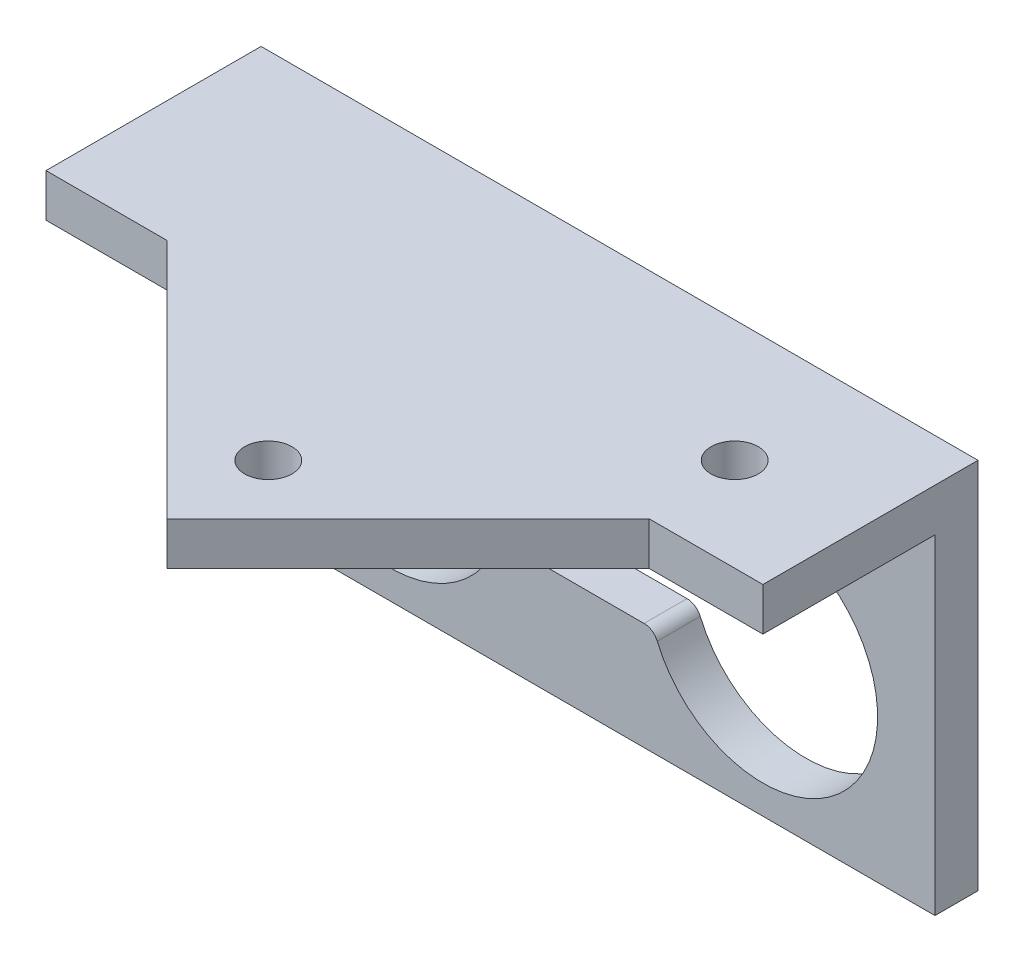
ISO-10303-21;
HEADER;
FILE_DESCRIPTION(('STEP AP214'),'2;1');
FILE_NAME('part.step','',(''),(''),'','','');
FILE_SCHEMA(('AUTOMOTIVE_DESIGN { 1 0 10303 214 1 1 1 1 }'));
ENDSEC;
DATA;
#1=APPLICATION_CONTEXT('core data for automotive mechanical design processes');
#2=APPLICATION_PROTOCOL_DEFINITION('international standard','automotive_design',2000,#1);
#3=PRODUCT_CONTEXT('',#1,'mechanical');
#4=PRODUCT('Part','Part','',(#3));
#5=PRODUCT_RELATED_PRODUCT_CATEGORY('part','',(#4));
#6=PRODUCT_DEFINITION_FORMATION('','',#4);
#7=PRODUCT_DEFINITION_CONTEXT('part definition',#1,'design');
#8=PRODUCT_DEFINITION('design','',#6,#7);
#9=PRODUCT_DEFINITION_SHAPE('','',#8);
#10=(LENGTH_UNIT() NAMED_UNIT(*) SI_UNIT(.MILLI.,.METRE.));
#11=(NAMED_UNIT(*) PLANE_ANGLE_UNIT() SI_UNIT($,.RADIAN.));
#12=(NAMED_UNIT(*) SI_UNIT($,.STERADIAN.) SOLID_ANGLE_UNIT());
#13=UNCERTAINTY_MEASURE_WITH_UNIT(LENGTH_MEASURE(1.E-05),#10,'distance_accuracy_value','');
#14=(GEOMETRIC_REPRESENTATION_CONTEXT(3) GLOBAL_UNCERTAINTY_ASSIGNED_CONTEXT((#13)) GLOBAL_UNIT_ASSIGNED_CONTEXT((#10,
#11,#12)) REPRESENTATION_CONTEXT('',''));
#15=CARTESIAN_POINT('',(0.,0.,0.));
#16=DIRECTION('',(0.,0.,1.));
#17=DIRECTION('',(1.,0.,0.));
#18=AXIS2_PLACEMENT_3D('',#15,#16,#17);
#19=CARTESIAN_POINT('',(-25.,16.,15.));
#20=DIRECTION('',(0.,0.,-1.));
#21=DIRECTION('',(-1.,0.,0.));
#22=AXIS2_PLACEMENT_3D('',#19,#20,#21);
#23=PLANE('',#22);
#24=DIRECTION('',(0.,1.,0.));
#25=VECTOR('',#24,1.);
#26=CARTESIAN_POINT('',(17.0710678118654,13.,14.9999999999999));
#27=LINE('',#26,#25);
#28=CARTESIAN_POINT('',(17.0710678118654,13.,14.9999999999999));
#29=VERTEX_POINT('',#28);
#30=CARTESIAN_POINT('',(17.0710678118654,16.,14.9999999999999));
#31=VERTEX_POINT('',#30);
#32=EDGE_CURVE('E186',#29,#31,#27,.T.);
#33=ORIENTED_EDGE('',*,*,#32,.F.);
#34=DIRECTION('',(-1.,0.,0.));
#35=VECTOR('',#34,1.);
#36=CARTESIAN_POINT('',(25.,13.,15.));
#37=LINE('',#36,#35);
#38=CARTESIAN_POINT('',(25.,13.,15.));
#39=VERTEX_POINT('',#38);
#40=EDGE_CURVE('E196',#39,#29,#37,.T.);
#41=ORIENTED_EDGE('',*,*,#40,.F.);
#42=DIRECTION('',(0.,-1.,0.));
#43=VECTOR('',#42,1.);
#44=CARTESIAN_POINT('',(25.,16.,15.));
#45=LINE('',#44,#43);
#46=CARTESIAN_POINT('',(25.,16.,15.));
#47=VERTEX_POINT('',#46);
#48=EDGE_CURVE('E233',#47,#39,#45,.T.);
#49=ORIENTED_EDGE('',*,*,#48,.F.);
#50=DIRECTION('',(1.,0.,0.));
#51=VECTOR('',#50,1.);
#52=CARTESIAN_POINT('',(-25.,16.,15.));
#53=LINE('',#52,#51);
#54=EDGE_CURVE('E223',#31,#47,#53,.T.);
#55=ORIENTED_EDGE('',*,*,#54,.F.);
#56=EDGE_LOOP('',(#33,#41,#49,#55));
#57=FACE_BOUND('',#56,.T.);
#58=ADVANCED_FACE('F36',(#57),#23,.F.);
#59=CARTESIAN_POINT('',(-16.5685424949238,13.,15.));
#60=VERTEX_POINT('',#59);
#61=CARTESIAN_POINT('',(-25.,13.,15.));
#62=VERTEX_POINT('',#61);
#63=EDGE_CURVE('E212',#60,#62,#37,.T.);
#64=ORIENTED_EDGE('',*,*,#63,.F.);
#65=DIRECTION('',(0.,1.,0.));
#66=VECTOR('',#65,1.);
#67=CARTESIAN_POINT('',(-16.5685424949238,13.,15.));
#68=LINE('',#67,#66);
#69=CARTESIAN_POINT('',(-16.5685424949238,16.,15.));
#70=VERTEX_POINT('',#69);
#71=EDGE_CURVE('E199',#60,#70,#68,.T.);
#72=ORIENTED_EDGE('',*,*,#71,.T.);
#73=CARTESIAN_POINT('',(-25.,16.,15.));
#74=VERTEX_POINT('',#73);
#75=EDGE_CURVE('E224',#74,#70,#53,.T.);
#76=ORIENTED_EDGE('',*,*,#75,.F.);
#77=DIRECTION('',(0.,-1.,0.));
#78=VECTOR('',#77,1.);
#79=CARTESIAN_POINT('',(-25.,16.,15.));
#80=LINE('',#79,#78);
#81=EDGE_CURVE('E236',#74,#62,#80,.T.);
#82=ORIENTED_EDGE('',*,*,#81,.T.);
#83=EDGE_LOOP('',(#64,#72,#76,#82));
#84=FACE_BOUND('',#83,.T.);
#85=ADVANCED_FACE('F362',(#84),#23,.F.);
#86=CARTESIAN_POINT('',(0.,0.,3.));
#87=DIRECTION('',(0.,0.,1.));
#88=DIRECTION('',(1.,0.,0.));
#89=AXIS2_PLACEMENT_3D('',#86,#87,#88);
#90=PLANE('',#89);
#91=DIRECTION('',(0.,-1.,0.));
#92=VECTOR('',#91,1.);
#93=CARTESIAN_POINT('',(-25.,-10.,3.));
#94=LINE('',#93,#92);
#95=CARTESIAN_POINT('',(-25.,13.,3.));
#96=VERTEX_POINT('',#95);
#97=CARTESIAN_POINT('',(-25.,-10.,3.));
#98=VERTEX_POINT('',#97);
#99=EDGE_CURVE('E328',#96,#98,#94,.T.);
#100=ORIENTED_EDGE('',*,*,#99,.T.);
#101=DIRECTION('',(1.,0.,0.));
#102=VECTOR('',#101,1.);
#103=CARTESIAN_POINT('',(25.,-10.,3.));
#104=LINE('',#103,#102);
#105=CARTESIAN_POINT('',(25.,-10.,3.));
#106=VERTEX_POINT('',#105);
#107=EDGE_CURVE('E331',#98,#106,#104,.T.);
#108=ORIENTED_EDGE('',*,*,#107,.T.);
#109=DIRECTION('',(0.,1.,0.));
#110=VECTOR('',#109,1.);
#111=CARTESIAN_POINT('',(25.,-10.,3.));
#112=LINE('',#111,#110);
#113=CARTESIAN_POINT('',(25.,13.,3.));
#114=VERTEX_POINT('',#113);
#115=EDGE_CURVE('E334',#106,#114,#112,.T.);
#116=ORIENTED_EDGE('',*,*,#115,.T.);
#117=DIRECTION('',(1.,0.,0.));
#118=VECTOR('',#117,1.);
#119=CARTESIAN_POINT('',(25.,13.,3.));
#120=LINE('',#119,#118);
#121=EDGE_CURVE('E217',#96,#114,#120,.T.);
#122=ORIENTED_EDGE('',*,*,#121,.F.);
#123=EDGE_LOOP('',(#100,#108,#116,#122));
#124=FACE_BOUND('',#123,.T.);
#125=CARTESIAN_POINT('',(13.,0.,3.));
#126=DIRECTION('',(0.,0.,1.));
#127=DIRECTION('',(1.,0.,0.));
#128=AXIS2_PLACEMENT_3D('',#125,#126,#127);
#129=CIRCLE('',#128,8.);
#130=CARTESIAN_POINT('',(5.62972268809911,-3.11111111111111,3.));
#131=VERTEX_POINT('',#130);
#132=CARTESIAN_POINT('',(5.62972268809911,3.11111111111111,3.));
#133=VERTEX_POINT('',#132);
#134=EDGE_CURVE('E271',#131,#133,#129,.T.);
#135=ORIENTED_EDGE('',*,*,#134,.F.);
#136=CARTESIAN_POINT('',(4.7084380241115,-3.5,3.));
#137=DIRECTION('',(0.,0.,-1.));
#138=DIRECTION('',(-1.,0.,0.));
#139=AXIS2_PLACEMENT_3D('',#136,#137,#138);
#140=CIRCLE('',#139,1.);
#141=CARTESIAN_POINT('',(4.7084380241115,-2.5,3.));
#142=VERTEX_POINT('',#141);
#143=EDGE_CURVE('E269',#142,#131,#140,.T.);
#144=ORIENTED_EDGE('',*,*,#143,.F.);
#145=DIRECTION('',(1.,0.,0.));
#146=VECTOR('',#145,1.);
#147=CARTESIAN_POINT('',(4.7084380241115,-2.5,3.));
#148=LINE('',#147,#146);
#149=CARTESIAN_POINT('',(-4.7084380241115,-2.5,3.));
#150=VERTEX_POINT('',#149);
#151=EDGE_CURVE('E285',#150,#142,#148,.T.);
#152=ORIENTED_EDGE('',*,*,#151,.F.);
#153=CARTESIAN_POINT('',(-4.7084380241115,-3.5,3.));
#154=DIRECTION('',(0.,0.,-1.));
#155=DIRECTION('',(1.,0.,0.));
#156=AXIS2_PLACEMENT_3D('',#153,#154,#155);
#157=CIRCLE('',#156,1.);
#158=CARTESIAN_POINT('',(-5.62972268809911,-3.11111111111111,3.));
#159=VERTEX_POINT('',#158);
#160=EDGE_CURVE('E282',#159,#150,#157,.T.);
#161=ORIENTED_EDGE('',*,*,#160,.F.);
#162=CARTESIAN_POINT('',(-13.,0.,3.));
#163=DIRECTION('',(0.,0.,1.));
#164=DIRECTION('',(1.,0.,0.));
#165=AXIS2_PLACEMENT_3D('',#162,#163,#164);
#166=CIRCLE('',#165,8.);
#167=CARTESIAN_POINT('',(-5.62972268809911,3.11111111111111,3.));
#168=VERTEX_POINT('',#167);
#169=EDGE_CURVE('E280',#168,#159,#166,.T.);
#170=ORIENTED_EDGE('',*,*,#169,.F.);
#171=CARTESIAN_POINT('',(-4.7084380241115,3.5,3.));
#172=DIRECTION('',(0.,0.,-1.));
#173=DIRECTION('',(-1.,0.,0.));
#174=AXIS2_PLACEMENT_3D('',#171,#172,#173);
#175=CIRCLE('',#174,1.);
#176=CARTESIAN_POINT('',(-4.7084380241115,2.5,3.));
#177=VERTEX_POINT('',#176);
#178=EDGE_CURVE('E278',#177,#168,#175,.T.);
#179=ORIENTED_EDGE('',*,*,#178,.F.);
#180=DIRECTION('',(-1.,0.,0.));
#181=VECTOR('',#180,1.);
#182=CARTESIAN_POINT('',(-4.7084380241115,2.5,3.));
#183=LINE('',#182,#181);
#184=CARTESIAN_POINT('',(4.7084380241115,2.5,3.));
#185=VERTEX_POINT('',#184);
#186=EDGE_CURVE('E276',#185,#177,#183,.T.);
#187=ORIENTED_EDGE('',*,*,#186,.F.);
#188=CARTESIAN_POINT('',(4.7084380241115,3.5,3.));
#189=DIRECTION('',(0.,0.,-1.));
#190=DIRECTION('',(1.,0.,0.));
#191=AXIS2_PLACEMENT_3D('',#188,#189,#190);
#192=CIRCLE('',#191,1.);
#193=EDGE_CURVE('E274',#133,#185,#192,.T.);
#194=ORIENTED_EDGE('',*,*,#193,.F.);
#195=EDGE_LOOP('',(#135,#144,#152,#161,#170,#179,#187,#194));
#196=FACE_BOUND('',#195,.T.);
#197=DIRECTION('',(-1.,0.,0.));
#198=VECTOR('',#197,1.);
#199=CARTESIAN_POINT('',(3.25,9.,3.));
#200=LINE('',#199,#198);
#201=CARTESIAN_POINT('',(3.25,9.,3.));
#202=VERTEX_POINT('',#201);
#203=CARTESIAN_POINT('',(-3.25,9.,3.));
#204=VERTEX_POINT('',#203);
#205=EDGE_CURVE('E242',#202,#204,#200,.T.);
#206=ORIENTED_EDGE('',*,*,#205,.F.);
#207=CARTESIAN_POINT('',(3.25,7.25,3.));
#208=DIRECTION('',(0.,0.,1.));
#209=DIRECTION('',(1.,0.,0.));
#210=AXIS2_PLACEMENT_3D('',#207,#208,#209);
#211=CIRCLE('',#210,1.75);
#212=CARTESIAN_POINT('',(3.25,5.5,3.));
#213=VERTEX_POINT('',#212);
#214=EDGE_CURVE('E240',#213,#202,#211,.T.);
#215=ORIENTED_EDGE('',*,*,#214,.F.);
#216=DIRECTION('',(1.,0.,0.));
#217=VECTOR('',#216,1.);
#218=CARTESIAN_POINT('',(3.25,5.5,3.));
#219=LINE('',#218,#217);
#220=CARTESIAN_POINT('',(-3.25,5.5,3.));
#221=VERTEX_POINT('',#220);
#222=EDGE_CURVE('E247',#221,#213,#219,.T.);
#223=ORIENTED_EDGE('',*,*,#222,.F.);
#224=CARTESIAN_POINT('',(-3.25,7.25,3.));
#225=DIRECTION('',(0.,0.,1.));
#226=DIRECTION('',(1.,0.,0.));
#227=AXIS2_PLACEMENT_3D('',#224,#225,#226);
#228=CIRCLE('',#227,1.75);
#229=EDGE_CURVE('E245',#204,#221,#228,.T.);
#230=ORIENTED_EDGE('',*,*,#229,.F.);
#231=EDGE_LOOP('',(#206,#215,#223,#230));
#232=FACE_BOUND('',#231,.T.);
#233=ADVANCED_FACE('F368',(#124,#196,#232),#90,.T.);
#234=CARTESIAN_POINT('',(0.,0.,0.));
#235=DIRECTION('',(0.,0.,1.));
#236=DIRECTION('',(1.,0.,0.));
#237=AXIS2_PLACEMENT_3D('',#234,#235,#236);
#238=PLANE('',#237);
#239=CARTESIAN_POINT('',(4.7084380241115,-3.5,0.));
#240=DIRECTION('',(0.,0.,-1.));
#241=DIRECTION('',(-1.,0.,0.));
#242=AXIS2_PLACEMENT_3D('',#239,#240,#241);
#243=CIRCLE('',#242,1.);
#244=CARTESIAN_POINT('',(4.7084380241115,-2.5,0.));
#245=VERTEX_POINT('',#244);
#246=CARTESIAN_POINT('',(5.62972268809911,-3.11111111111111,0.));
#247=VERTEX_POINT('',#246);
#248=EDGE_CURVE('E268',#245,#247,#243,.T.);
#249=ORIENTED_EDGE('',*,*,#248,.T.);
#250=CARTESIAN_POINT('',(13.,0.,0.));
#251=DIRECTION('',(0.,0.,1.));
#252=DIRECTION('',(1.,0.,0.));
#253=AXIS2_PLACEMENT_3D('',#250,#251,#252);
#254=CIRCLE('',#253,8.);
#255=CARTESIAN_POINT('',(5.62972268809911,3.11111111111111,0.));
#256=VERTEX_POINT('',#255);
#257=EDGE_CURVE('E290',#247,#256,#254,.T.);
#258=ORIENTED_EDGE('',*,*,#257,.T.);
#259=CARTESIAN_POINT('',(4.7084380241115,3.5,0.));
#260=DIRECTION('',(0.,0.,-1.));
#261=DIRECTION('',(1.,0.,0.));
#262=AXIS2_PLACEMENT_3D('',#259,#260,#261);
#263=CIRCLE('',#262,1.);
#264=CARTESIAN_POINT('',(4.7084380241115,2.5,0.));
#265=VERTEX_POINT('',#264);
#266=EDGE_CURVE('E293',#256,#265,#263,.T.);
#267=ORIENTED_EDGE('',*,*,#266,.T.);
#268=DIRECTION('',(-1.,0.,0.));
#269=VECTOR('',#268,1.);
#270=CARTESIAN_POINT('',(-4.7084380241115,2.5,0.));
#271=LINE('',#270,#269);
#272=CARTESIAN_POINT('',(-4.7084380241115,2.5,0.));
#273=VERTEX_POINT('',#272);
#274=EDGE_CURVE('E296',#265,#273,#271,.T.);
#275=ORIENTED_EDGE('',*,*,#274,.T.);
#276=CARTESIAN_POINT('',(-4.7084380241115,3.5,0.));
#277=DIRECTION('',(0.,0.,-1.));
#278=DIRECTION('',(-1.,0.,0.));
#279=AXIS2_PLACEMENT_3D('',#276,#277,#278);
#280=CIRCLE('',#279,1.);
#281=CARTESIAN_POINT('',(-5.62972268809911,3.11111111111111,0.));
#282=VERTEX_POINT('',#281);
#283=EDGE_CURVE('E299',#273,#282,#280,.T.);
#284=ORIENTED_EDGE('',*,*,#283,.T.);
#285=CARTESIAN_POINT('',(-13.,0.,0.));
#286=DIRECTION('',(0.,0.,1.));
#287=DIRECTION('',(1.,0.,0.));
#288=AXIS2_PLACEMENT_3D('',#285,#286,#287);
#289=CIRCLE('',#288,8.);
#290=CARTESIAN_POINT('',(-5.62972268809911,-3.11111111111111,0.));
#291=VERTEX_POINT('',#290);
#292=EDGE_CURVE('E302',#282,#291,#289,.T.);
#293=ORIENTED_EDGE('',*,*,#292,.T.);
#294=CARTESIAN_POINT('',(-4.7084380241115,-3.5,0.));
#295=DIRECTION('',(0.,0.,-1.));
#296=DIRECTION('',(1.,0.,0.));
#297=AXIS2_PLACEMENT_3D('',#294,#295,#296);
#298=CIRCLE('',#297,1.);
#299=CARTESIAN_POINT('',(-4.7084380241115,-2.5,0.));
#300=VERTEX_POINT('',#299);
#301=EDGE_CURVE('E305',#291,#300,#298,.T.);
#302=ORIENTED_EDGE('',*,*,#301,.T.);
#303=DIRECTION('',(1.,0.,0.));
#304=VECTOR('',#303,1.);
#305=CARTESIAN_POINT('',(4.7084380241115,-2.5,0.));
#306=LINE('',#305,#304);
#307=EDGE_CURVE('E272',#300,#245,#306,.T.);
#308=ORIENTED_EDGE('',*,*,#307,.T.);
#309=EDGE_LOOP('',(#249,#258,#267,#275,#284,#293,#302,#308));
#310=FACE_BOUND('',#309,.T.);
#311=DIRECTION('',(0.,-1.,0.));
#312=VECTOR('',#311,1.);
#313=CARTESIAN_POINT('',(-25.,-10.,0.));
#314=LINE('',#313,#312);
#315=CARTESIAN_POINT('',(-25.,16.,0.));
#316=VERTEX_POINT('',#315);
#317=CARTESIAN_POINT('',(-25.,-10.,0.));
#318=VERTEX_POINT('',#317);
#319=EDGE_CURVE('E327',#316,#318,#314,.T.);
#320=ORIENTED_EDGE('',*,*,#319,.F.);
#321=DIRECTION('',(-1.,0.,0.));
#322=VECTOR('',#321,1.);
#323=CARTESIAN_POINT('',(-25.,16.,0.));
#324=LINE('',#323,#322);
#325=CARTESIAN_POINT('',(25.,16.,0.));
#326=VERTEX_POINT('',#325);
#327=EDGE_CURVE('E230',#326,#316,#324,.T.);
#328=ORIENTED_EDGE('',*,*,#327,.F.);
#329=DIRECTION('',(0.,1.,0.));
#330=VECTOR('',#329,1.);
#331=CARTESIAN_POINT('',(25.,-10.,0.));
#332=LINE('',#331,#330);
#333=CARTESIAN_POINT('',(25.,-10.,0.));
#334=VERTEX_POINT('',#333);
#335=EDGE_CURVE('E332',#334,#326,#332,.T.);
#336=ORIENTED_EDGE('',*,*,#335,.F.);
#337=DIRECTION('',(1.,0.,0.));
#338=VECTOR('',#337,1.);
#339=CARTESIAN_POINT('',(25.,-10.,0.));
#340=LINE('',#339,#338);
#341=EDGE_CURVE('E338',#318,#334,#340,.T.);
#342=ORIENTED_EDGE('',*,*,#341,.F.);
#343=EDGE_LOOP('',(#320,#328,#336,#342));
#344=FACE_BOUND('',#343,.T.);
#345=CARTESIAN_POINT('',(3.25,7.25,0.));
#346=DIRECTION('',(0.,0.,1.));
#347=DIRECTION('',(1.,0.,0.));
#348=AXIS2_PLACEMENT_3D('',#345,#346,#347);
#349=CIRCLE('',#348,1.75);
#350=CARTESIAN_POINT('',(3.25,5.5,0.));
#351=VERTEX_POINT('',#350);
#352=CARTESIAN_POINT('',(3.25,9.,0.));
#353=VERTEX_POINT('',#352);
#354=EDGE_CURVE('E239',#351,#353,#349,.T.);
#355=ORIENTED_EDGE('',*,*,#354,.T.);
#356=DIRECTION('',(-1.,0.,0.));
#357=VECTOR('',#356,1.);
#358=CARTESIAN_POINT('',(3.25,9.,0.));
#359=LINE('',#358,#357);
#360=CARTESIAN_POINT('',(-3.25,9.,0.));
#361=VERTEX_POINT('',#360);
#362=EDGE_CURVE('E252',#353,#361,#359,.T.);
#363=ORIENTED_EDGE('',*,*,#362,.T.);
#364=CARTESIAN_POINT('',(-3.25,7.25,0.));
#365=DIRECTION('',(0.,0.,1.));
#366=DIRECTION('',(1.,0.,0.));
#367=AXIS2_PLACEMENT_3D('',#364,#365,#366);
#368=CIRCLE('',#367,1.75);
#369=CARTESIAN_POINT('',(-3.25,5.5,0.));
#370=VERTEX_POINT('',#369);
#371=EDGE_CURVE('E255',#361,#370,#368,.T.);
#372=ORIENTED_EDGE('',*,*,#371,.T.);
#373=DIRECTION('',(1.,0.,0.));
#374=VECTOR('',#373,1.);
#375=CARTESIAN_POINT('',(3.25,5.5,0.));
#376=LINE('',#375,#374);
#377=EDGE_CURVE('E243',#370,#351,#376,.T.);
#378=ORIENTED_EDGE('',*,*,#377,.T.);
#379=EDGE_LOOP('',(#355,#363,#372,#378));
#380=FACE_BOUND('',#379,.T.);
#381=ADVANCED_FACE('F351',(#310,#344,#380),#238,.F.);
#382=CARTESIAN_POINT('',(-25.,-10.,3.));
#383=DIRECTION('',(1.,0.,0.));
#384=DIRECTION('',(0.,0.,-1.));
#385=AXIS2_PLACEMENT_3D('',#382,#383,#384);
#386=PLANE('',#385);
#387=ORIENTED_EDGE('',*,*,#99,.F.);
#388=DIRECTION('',(0.,0.,-1.));
#389=VECTOR('',#388,1.);
#390=CARTESIAN_POINT('',(-25.,13.,3.));
#391=LINE('',#390,#389);
#392=EDGE_CURVE('E214',#62,#96,#391,.T.);
#393=ORIENTED_EDGE('',*,*,#392,.F.);
#394=ORIENTED_EDGE('',*,*,#81,.F.);
#395=DIRECTION('',(0.,0.,1.));
#396=VECTOR('',#395,1.);
#397=CARTESIAN_POINT('',(-25.,16.,0.));
#398=LINE('',#397,#396);
#399=EDGE_CURVE('E220',#316,#74,#398,.T.);
#400=ORIENTED_EDGE('',*,*,#399,.F.);
#401=ORIENTED_EDGE('',*,*,#319,.T.);
#402=DIRECTION('',(0.,0.,-1.));
#403=VECTOR('',#402,1.);
#404=CARTESIAN_POINT('',(-25.,-10.,3.));
#405=LINE('',#404,#403);
#406=EDGE_CURVE('E11',#98,#318,#405,.T.);
#407=ORIENTED_EDGE('',*,*,#406,.F.);
#408=EDGE_LOOP('',(#387,#393,#394,#400,#401,#407));
#409=FACE_BOUND('',#408,.T.);
#410=ADVANCED_FACE('F38',(#409),#386,.F.);
#411=CARTESIAN_POINT('',(25.,-10.,3.));
#412=DIRECTION('',(0.,1.,0.));
#413=DIRECTION('',(-1.,0.,0.));
#414=AXIS2_PLACEMENT_3D('',#411,#412,#413);
#415=PLANE('',#414);
#416=ORIENTED_EDGE('',*,*,#341,.T.);
#417=DIRECTION('',(0.,0.,-1.));
#418=VECTOR('',#417,1.);
#419=CARTESIAN_POINT('',(25.,-10.,3.));
#420=LINE('',#419,#418);
#421=EDGE_CURVE('E44',#106,#334,#420,.T.);
#422=ORIENTED_EDGE('',*,*,#421,.F.);
#423=ORIENTED_EDGE('',*,*,#107,.F.);
#424=ORIENTED_EDGE('',*,*,#406,.T.);
#425=EDGE_LOOP('',(#416,#422,#423,#424));
#426=FACE_BOUND('',#425,.T.);
#427=ADVANCED_FACE('F370',(#426),#415,.F.);
#428=CARTESIAN_POINT('',(25.,-10.,3.));
#429=DIRECTION('',(-1.,0.,0.));
#430=DIRECTION('',(0.,0.,1.));
#431=AXIS2_PLACEMENT_3D('',#428,#429,#430);
#432=PLANE('',#431);
#433=DIRECTION('',(0.,0.,1.));
#434=VECTOR('',#433,1.);
#435=CARTESIAN_POINT('',(25.,13.,3.));
#436=LINE('',#435,#434);
#437=EDGE_CURVE('E209',#114,#39,#436,.T.);
#438=ORIENTED_EDGE('',*,*,#437,.F.);
#439=ORIENTED_EDGE('',*,*,#115,.F.);
#440=ORIENTED_EDGE('',*,*,#421,.T.);
#441=ORIENTED_EDGE('',*,*,#335,.T.);
#442=DIRECTION('',(0.,0.,-1.));
#443=VECTOR('',#442,1.);
#444=CARTESIAN_POINT('',(25.,16.,0.));
#445=LINE('',#444,#443);
#446=EDGE_CURVE('E227',#47,#326,#445,.T.);
#447=ORIENTED_EDGE('',*,*,#446,.F.);
#448=ORIENTED_EDGE('',*,*,#48,.T.);
#449=EDGE_LOOP('',(#438,#439,#440,#441,#447,#448));
#450=FACE_BOUND('',#449,.T.);
#451=ADVANCED_FACE('F346',(#450),#432,.F.);
#452=CARTESIAN_POINT('',(4.7084380241115,-3.5,3.));
#453=DIRECTION('',(0.,0.,-1.));
#454=DIRECTION('',(-1.,0.,0.));
#455=AXIS2_PLACEMENT_3D('',#452,#453,#454);
#456=CYLINDRICAL_SURFACE('',#455,1.);
#457=ORIENTED_EDGE('',*,*,#248,.F.);
#458=DIRECTION('',(0.,0.,-1.));
#459=VECTOR('',#458,1.);
#460=CARTESIAN_POINT('',(4.7084380241115,-2.5,3.));
#461=LINE('',#460,#459);
#462=EDGE_CURVE('E287',#142,#245,#461,.T.);
#463=ORIENTED_EDGE('',*,*,#462,.F.);
#464=ORIENTED_EDGE('',*,*,#143,.T.);
#465=DIRECTION('',(0.,0.,-1.));
#466=VECTOR('',#465,1.);
#467=CARTESIAN_POINT('',(5.62972268809911,-3.11111111111111,3.));
#468=LINE('',#467,#466);
#469=EDGE_CURVE('E324',#131,#247,#468,.T.);
#470=ORIENTED_EDGE('',*,*,#469,.T.);
#471=EDGE_LOOP('',(#457,#463,#464,#470));
#472=FACE_BOUND('',#471,.T.);
#473=ADVANCED_FACE('F376',(#472),#456,.T.);
#474=CARTESIAN_POINT('',(13.,0.,3.));
#475=DIRECTION('',(0.,0.,-1.));
#476=DIRECTION('',(-1.,0.,0.));
#477=AXIS2_PLACEMENT_3D('',#474,#475,#476);
#478=CYLINDRICAL_SURFACE('',#477,8.);
#479=ORIENTED_EDGE('',*,*,#257,.F.);
#480=ORIENTED_EDGE('',*,*,#469,.F.);
#481=ORIENTED_EDGE('',*,*,#134,.T.);
#482=DIRECTION('',(0.,0.,-1.));
#483=VECTOR('',#482,1.);
#484=CARTESIAN_POINT('',(5.62972268809911,3.11111111111111,3.));
#485=LINE('',#484,#483);
#486=EDGE_CURVE('E322',#133,#256,#485,.T.);
#487=ORIENTED_EDGE('',*,*,#486,.T.);
#488=EDGE_LOOP('',(#479,#480,#481,#487));
#489=FACE_BOUND('',#488,.T.);
#490=ADVANCED_FACE('F424',(#489),#478,.F.);
#491=CARTESIAN_POINT('',(4.7084380241115,3.5,3.));
#492=DIRECTION('',(0.,0.,-1.));
#493=DIRECTION('',(-1.,0.,0.));
#494=AXIS2_PLACEMENT_3D('',#491,#492,#493);
#495=CYLINDRICAL_SURFACE('',#494,1.);
#496=ORIENTED_EDGE('',*,*,#266,.F.);
#497=ORIENTED_EDGE('',*,*,#486,.F.);
#498=ORIENTED_EDGE('',*,*,#193,.T.);
#499=DIRECTION('',(0.,0.,-1.));
#500=VECTOR('',#499,1.);
#501=CARTESIAN_POINT('',(4.7084380241115,2.5,3.));
#502=LINE('',#501,#500);
#503=EDGE_CURVE('E320',#185,#265,#502,.T.);
#504=ORIENTED_EDGE('',*,*,#503,.T.);
#505=EDGE_LOOP('',(#496,#497,#498,#504));
#506=FACE_BOUND('',#505,.T.);
#507=ADVANCED_FACE('F420',(#506),#495,.T.);
#508=CARTESIAN_POINT('',(-4.7084380241115,2.5,3.));
#509=DIRECTION('',(0.,-1.,0.));
#510=DIRECTION('',(0.,0.,-1.));
#511=AXIS2_PLACEMENT_3D('',#508,#509,#510);
#512=PLANE('',#511);
#513=ORIENTED_EDGE('',*,*,#274,.F.);
#514=ORIENTED_EDGE('',*,*,#503,.F.);
#515=ORIENTED_EDGE('',*,*,#186,.T.);
#516=DIRECTION('',(0.,0.,-1.));
#517=VECTOR('',#516,1.);
#518=CARTESIAN_POINT('',(-4.7084380241115,2.5,3.));
#519=LINE('',#518,#517);
#520=EDGE_CURVE('E318',#177,#273,#519,.T.);
#521=ORIENTED_EDGE('',*,*,#520,.T.);
#522=EDGE_LOOP('',(#513,#514,#515,#521));
#523=FACE_BOUND('',#522,.T.);
#524=ADVANCED_FACE('F416',(#523),#512,.T.);
#525=CARTESIAN_POINT('',(-4.7084380241115,3.5,3.));
#526=DIRECTION('',(0.,0.,-1.));
#527=DIRECTION('',(-1.,0.,0.));
#528=AXIS2_PLACEMENT_3D('',#525,#526,#527);
#529=CYLINDRICAL_SURFACE('',#528,1.);
#530=ORIENTED_EDGE('',*,*,#283,.F.);
#531=ORIENTED_EDGE('',*,*,#520,.F.);
#532=ORIENTED_EDGE('',*,*,#178,.T.);
#533=DIRECTION('',(0.,0.,-1.));
#534=VECTOR('',#533,1.);
#535=CARTESIAN_POINT('',(-5.62972268809911,3.11111111111111,3.));
#536=LINE('',#535,#534);
#537=EDGE_CURVE('E316',#168,#282,#536,.T.);
#538=ORIENTED_EDGE('',*,*,#537,.T.);
#539=EDGE_LOOP('',(#530,#531,#532,#538));
#540=FACE_BOUND('',#539,.T.);
#541=ADVANCED_FACE('F412',(#540),#529,.T.);
#542=CARTESIAN_POINT('',(-13.,0.,3.));
#543=DIRECTION('',(0.,0.,-1.));
#544=DIRECTION('',(-1.,0.,0.));
#545=AXIS2_PLACEMENT_3D('',#542,#543,#544);
#546=CYLINDRICAL_SURFACE('',#545,8.);
#547=ORIENTED_EDGE('',*,*,#292,.F.);
#548=ORIENTED_EDGE('',*,*,#537,.F.);
#549=ORIENTED_EDGE('',*,*,#169,.T.);
#550=DIRECTION('',(0.,0.,-1.));
#551=VECTOR('',#550,1.);
#552=CARTESIAN_POINT('',(-5.62972268809911,-3.11111111111111,3.));
#553=LINE('',#552,#551);
#554=EDGE_CURVE('E314',#159,#291,#553,.T.);
#555=ORIENTED_EDGE('',*,*,#554,.T.);
#556=EDGE_LOOP('',(#547,#548,#549,#555));
#557=FACE_BOUND('',#556,.T.);
#558=ADVANCED_FACE('F408',(#557),#546,.F.);
#559=CARTESIAN_POINT('',(-4.7084380241115,-3.5,3.));
#560=DIRECTION('',(0.,0.,-1.));
#561=DIRECTION('',(-1.,0.,0.));
#562=AXIS2_PLACEMENT_3D('',#559,#560,#561);
#563=CYLINDRICAL_SURFACE('',#562,1.);
#564=ORIENTED_EDGE('',*,*,#301,.F.);
#565=ORIENTED_EDGE('',*,*,#554,.F.);
#566=ORIENTED_EDGE('',*,*,#160,.T.);
#567=DIRECTION('',(0.,0.,-1.));
#568=VECTOR('',#567,1.);
#569=CARTESIAN_POINT('',(-4.7084380241115,-2.5,3.));
#570=LINE('',#569,#568);
#571=EDGE_CURVE('E312',#150,#300,#570,.T.);
#572=ORIENTED_EDGE('',*,*,#571,.T.);
#573=EDGE_LOOP('',(#564,#565,#566,#572));
#574=FACE_BOUND('',#573,.T.);
#575=ADVANCED_FACE('F404',(#574),#563,.T.);
#576=CARTESIAN_POINT('',(4.7084380241115,-2.5,3.));
#577=DIRECTION('',(0.,1.,0.));
#578=DIRECTION('',(-1.,0.,0.));
#579=AXIS2_PLACEMENT_3D('',#576,#577,#578);
#580=PLANE('',#579);
#581=ORIENTED_EDGE('',*,*,#307,.F.);
#582=ORIENTED_EDGE('',*,*,#571,.F.);
#583=ORIENTED_EDGE('',*,*,#151,.T.);
#584=ORIENTED_EDGE('',*,*,#462,.T.);
#585=EDGE_LOOP('',(#581,#582,#583,#584));
#586=FACE_BOUND('',#585,.T.);
#587=ADVANCED_FACE('F400',(#586),#580,.T.);
#588=CARTESIAN_POINT('',(3.25,7.25,3.));
#589=DIRECTION('',(0.,0.,-1.));
#590=DIRECTION('',(-1.,0.,0.));
#591=AXIS2_PLACEMENT_3D('',#588,#589,#590);
#592=CYLINDRICAL_SURFACE('',#591,1.75);
#593=ORIENTED_EDGE('',*,*,#354,.F.);
#594=DIRECTION('',(0.,0.,-1.));
#595=VECTOR('',#594,1.);
#596=CARTESIAN_POINT('',(3.25,5.5,3.));
#597=LINE('',#596,#595);
#598=EDGE_CURVE('E249',#213,#351,#597,.T.);
#599=ORIENTED_EDGE('',*,*,#598,.F.);
#600=ORIENTED_EDGE('',*,*,#214,.T.);
#601=DIRECTION('',(0.,0.,-1.));
#602=VECTOR('',#601,1.);
#603=CARTESIAN_POINT('',(3.25,9.,3.));
#604=LINE('',#603,#602);
#605=EDGE_CURVE('E265',#202,#353,#604,.T.);
#606=ORIENTED_EDGE('',*,*,#605,.T.);
#607=EDGE_LOOP('',(#593,#599,#600,#606));
#608=FACE_BOUND('',#607,.T.);
#609=ADVANCED_FACE('F396',(#608),#592,.F.);
#610=CARTESIAN_POINT('',(3.25,9.,3.));
#611=DIRECTION('',(0.,-1.,0.));
#612=DIRECTION('',(1.,0.,0.));
#613=AXIS2_PLACEMENT_3D('',#610,#611,#612);
#614=PLANE('',#613);
#615=ORIENTED_EDGE('',*,*,#362,.F.);
#616=ORIENTED_EDGE('',*,*,#605,.F.);
#617=ORIENTED_EDGE('',*,*,#205,.T.);
#618=DIRECTION('',(0.,0.,-1.));
#619=VECTOR('',#618,1.);
#620=CARTESIAN_POINT('',(-3.25,9.,3.));
#621=LINE('',#620,#619);
#622=EDGE_CURVE('E263',#204,#361,#621,.T.);
#623=ORIENTED_EDGE('',*,*,#622,.T.);
#624=EDGE_LOOP('',(#615,#616,#617,#623));
#625=FACE_BOUND('',#624,.T.);
#626=ADVANCED_FACE('F392',(#625),#614,.T.);
#627=CARTESIAN_POINT('',(-3.25,7.25,3.));
#628=DIRECTION('',(0.,0.,-1.));
#629=DIRECTION('',(-1.,0.,0.));
#630=AXIS2_PLACEMENT_3D('',#627,#628,#629);
#631=CYLINDRICAL_SURFACE('',#630,1.75);
#632=ORIENTED_EDGE('',*,*,#371,.F.);
#633=ORIENTED_EDGE('',*,*,#622,.F.);
#634=ORIENTED_EDGE('',*,*,#229,.T.);
#635=DIRECTION('',(0.,0.,-1.));
#636=VECTOR('',#635,1.);
#637=CARTESIAN_POINT('',(-3.25,5.5,3.));
#638=LINE('',#637,#636);
#639=EDGE_CURVE('E59',#221,#370,#638,.T.);
#640=ORIENTED_EDGE('',*,*,#639,.T.);
#641=EDGE_LOOP('',(#632,#633,#634,#640));
#642=FACE_BOUND('',#641,.T.);
#643=ADVANCED_FACE('F389',(#642),#631,.F.);
#644=CARTESIAN_POINT('',(3.25,5.5,3.));
#645=DIRECTION('',(0.,1.,0.));
#646=DIRECTION('',(0.,0.,1.));
#647=AXIS2_PLACEMENT_3D('',#644,#645,#646);
#648=PLANE('',#647);
#649=ORIENTED_EDGE('',*,*,#377,.F.);
#650=ORIENTED_EDGE('',*,*,#639,.F.);
#651=ORIENTED_EDGE('',*,*,#222,.T.);
#652=ORIENTED_EDGE('',*,*,#598,.T.);
#653=EDGE_LOOP('',(#649,#650,#651,#652));
#654=FACE_BOUND('',#653,.T.);
#655=ADVANCED_FACE('F386',(#654),#648,.T.);
#656=CARTESIAN_POINT('',(0.,16.,0.));
#657=DIRECTION('',(0.,1.,0.));
#658=DIRECTION('',(-1.,0.,0.));
#659=AXIS2_PLACEMENT_3D('',#656,#657,#658);
#660=PLANE('',#659);
#661=CARTESIAN_POINT('',(16.5147186257614,16.,8.48528137423851));
#662=DIRECTION('',(0.,1.,0.));
#663=DIRECTION('',(-1.,0.,0.));
#664=AXIS2_PLACEMENT_3D('',#661,#662,#663);
#665=CIRCLE('',#664,1.65);
#666=CARTESIAN_POINT('',(14.8647186257614,16.,8.48528137423851));
#667=VERTEX_POINT('',#666);
#668=EDGE_CURVE('E559',#667,#667,#665,.T.);
#669=ORIENTED_EDGE('',*,*,#668,.F.);
#670=EDGE_LOOP('',(#669));
#671=FACE_BOUND('',#670,.T.);
#672=ORIENTED_EDGE('',*,*,#399,.T.);
#673=ORIENTED_EDGE('',*,*,#75,.T.);
#674=DIRECTION('',(0.707106781186547,0.,0.707106781186547));
#675=VECTOR('',#674,1.);
#676=CARTESIAN_POINT('',(0.251262658470822,16.,31.8198051533946));
#677=LINE('',#676,#675);
#678=CARTESIAN_POINT('',(0.251262658470822,16.,31.8198051533946));
#679=VERTEX_POINT('',#678);
#680=EDGE_CURVE('E51',#70,#679,#677,.T.);
#681=ORIENTED_EDGE('',*,*,#680,.T.);
#682=DIRECTION('',(0.707106781186546,0.,-0.707106781186549));
#683=VECTOR('',#682,1.);
#684=CARTESIAN_POINT('',(0.251262658470822,16.,31.8198051533946));
#685=LINE('',#684,#683);
#686=EDGE_CURVE('E184',#679,#31,#685,.T.);
#687=ORIENTED_EDGE('',*,*,#686,.T.);
#688=ORIENTED_EDGE('',*,*,#54,.T.);
#689=ORIENTED_EDGE('',*,*,#446,.T.);
#690=ORIENTED_EDGE('',*,*,#327,.T.);
#691=EDGE_LOOP('',(#672,#673,#681,#687,#688,#689,#690));
#692=FACE_BOUND('',#691,.T.);
#693=CARTESIAN_POINT('',(0.25126265847077,16.,24.7487373415291));
#694=DIRECTION('',(0.,1.,0.));
#695=DIRECTION('',(1.,0.,0.));
#696=AXIS2_PLACEMENT_3D('',#693,#694,#695);
#697=CIRCLE('',#696,1.65);
#698=CARTESIAN_POINT('',(1.90126265847077,16.,24.7487373415291));
#699=VERTEX_POINT('',#698);
#700=EDGE_CURVE('E203',#699,#699,#697,.T.);
#701=ORIENTED_EDGE('',*,*,#700,.F.);
#702=EDGE_LOOP('',(#701));
#703=FACE_BOUND('',#702,.T.);
#704=ADVANCED_FACE('F355',(#671,#692,#703),#660,.T.);
#705=CARTESIAN_POINT('',(0.,13.,0.));
#706=DIRECTION('',(0.,-1.,0.));
#707=DIRECTION('',(1.,0.,0.));
#708=AXIS2_PLACEMENT_3D('',#705,#706,#707);
#709=PLANE('',#708);
#710=CARTESIAN_POINT('',(16.5147186257614,13.,8.48528137423851));
#711=DIRECTION('',(0.,1.,0.));
#712=DIRECTION('',(-1.,0.,0.));
#713=AXIS2_PLACEMENT_3D('',#710,#711,#712);
#714=CIRCLE('',#713,1.65);
#715=CARTESIAN_POINT('',(14.8647186257614,13.,8.48528137423851));
#716=VERTEX_POINT('',#715);
#717=EDGE_CURVE('E556',#716,#716,#714,.T.);
#718=ORIENTED_EDGE('',*,*,#717,.T.);
#719=EDGE_LOOP('',(#718));
#720=FACE_BOUND('',#719,.T.);
#721=ORIENTED_EDGE('',*,*,#437,.T.);
#722=ORIENTED_EDGE('',*,*,#40,.T.);
#723=DIRECTION('',(0.707106781186546,0.,-0.707106781186549));
#724=VECTOR('',#723,1.);
#725=CARTESIAN_POINT('',(0.251262658470823,13.,31.8198051533946));
#726=LINE('',#725,#724);
#727=CARTESIAN_POINT('',(0.251262658470823,13.,31.8198051533946));
#728=VERTEX_POINT('',#727);
#729=EDGE_CURVE('E181',#728,#29,#726,.T.);
#730=ORIENTED_EDGE('',*,*,#729,.F.);
#731=DIRECTION('',(0.707106781186547,0.,0.707106781186547));
#732=VECTOR('',#731,1.);
#733=CARTESIAN_POINT('',(0.251262658470823,13.,31.8198051533946));
#734=LINE('',#733,#732);
#735=EDGE_CURVE('E193',#60,#728,#734,.T.);
#736=ORIENTED_EDGE('',*,*,#735,.F.);
#737=ORIENTED_EDGE('',*,*,#63,.T.);
#738=ORIENTED_EDGE('',*,*,#392,.T.);
#739=ORIENTED_EDGE('',*,*,#121,.T.);
#740=EDGE_LOOP('',(#721,#722,#730,#736,#737,#738,#739));
#741=FACE_BOUND('',#740,.T.);
#742=CARTESIAN_POINT('',(0.25126265847077,13.,24.7487373415291));
#743=DIRECTION('',(0.,1.,0.));
#744=DIRECTION('',(1.,0.,0.));
#745=AXIS2_PLACEMENT_3D('',#742,#743,#744);
#746=CIRCLE('',#745,1.65);
#747=CARTESIAN_POINT('',(1.90126265847077,13.,24.7487373415291));
#748=VERTEX_POINT('',#747);
#749=EDGE_CURVE('E206',#748,#748,#746,.T.);
#750=ORIENTED_EDGE('',*,*,#749,.T.);
#751=EDGE_LOOP('',(#750));
#752=FACE_BOUND('',#751,.T.);
#753=ADVANCED_FACE('F191',(#720,#741,#752),#709,.T.);
#754=CARTESIAN_POINT('',(0.251262658470823,13.,31.8198051533946));
#755=DIRECTION('',(-0.707106781186548,0.,0.707106781186548));
#756=DIRECTION('',(0.707106781186548,0.,0.707106781186548));
#757=AXIS2_PLACEMENT_3D('',#754,#755,#756);
#758=PLANE('',#757);
#759=ORIENTED_EDGE('',*,*,#680,.F.);
#760=ORIENTED_EDGE('',*,*,#71,.F.);
#761=ORIENTED_EDGE('',*,*,#735,.T.);
#762=DIRECTION('',(0.,1.,0.));
#763=VECTOR('',#762,1.);
#764=CARTESIAN_POINT('',(0.251262658470823,13.,31.8198051533946));
#765=LINE('',#764,#763);
#766=EDGE_CURVE('E178',#728,#679,#765,.T.);
#767=ORIENTED_EDGE('',*,*,#766,.T.);
#768=EDGE_LOOP('',(#759,#760,#761,#767));
#769=FACE_BOUND('',#768,.T.);
#770=ADVANCED_FACE('F198',(#769),#758,.T.);
#771=CARTESIAN_POINT('',(0.251262658470823,13.,31.8198051533946));
#772=DIRECTION('',(0.707106781186549,0.,0.707106781186546));
#773=DIRECTION('',(0.707106781186546,0.,-0.707106781186549));
#774=AXIS2_PLACEMENT_3D('',#771,#772,#773);
#775=PLANE('',#774);
#776=ORIENTED_EDGE('',*,*,#686,.F.);
#777=ORIENTED_EDGE('',*,*,#766,.F.);
#778=ORIENTED_EDGE('',*,*,#729,.T.);
#779=ORIENTED_EDGE('',*,*,#32,.T.);
#780=EDGE_LOOP('',(#776,#777,#778,#779));
#781=FACE_BOUND('',#780,.T.);
#782=ADVANCED_FACE('F180',(#781),#775,.T.);
#783=CARTESIAN_POINT('',(0.25126265847077,13.,24.7487373415291));
#784=DIRECTION('',(0.,1.,0.));
#785=DIRECTION('',(-1.,0.,0.));
#786=AXIS2_PLACEMENT_3D('',#783,#784,#785);
#787=CYLINDRICAL_SURFACE('',#786,1.65);
#788=ORIENTED_EDGE('',*,*,#749,.F.);
#789=EDGE_LOOP('',(#788));
#790=FACE_BOUND('',#789,.T.);
#791=ORIENTED_EDGE('',*,*,#700,.T.);
#792=EDGE_LOOP('',(#791));
#793=FACE_BOUND('',#792,.T.);
#794=ADVANCED_FACE('F517',(#790,#793),#787,.F.);
#795=CARTESIAN_POINT('',(16.5147186257614,13.,8.48528137423851));
#796=DIRECTION('',(0.,1.,0.));
#797=DIRECTION('',(-1.,0.,0.));
#798=AXIS2_PLACEMENT_3D('',#795,#796,#797);
#799=CYLINDRICAL_SURFACE('',#798,1.65);
#800=ORIENTED_EDGE('',*,*,#717,.F.);
#801=EDGE_LOOP('',(#800));
#802=FACE_BOUND('',#801,.T.);
#803=ORIENTED_EDGE('',*,*,#668,.T.);
#804=EDGE_LOOP('',(#803));
#805=FACE_BOUND('',#804,.T.);
#806=ADVANCED_FACE('F526',(#802,#805),#799,.F.);
#807=CLOSED_SHELL('',(#58,#85,#233,#381,#410,#427,#451,#473,#490,#507,#524,#541,#558,#575,#587,
#609,#626,#643,#655,#704,#753,#770,#782,#794,#806));
#808=MANIFOLD_SOLID_BREP('B2',#807);
#809=ADVANCED_BREP_SHAPE_REPRESENTATION('',(#18,#808),#14);
#810=SHAPE_DEFINITION_REPRESENTATION(#9,#809);
ENDSEC;
END-ISO-10303-21;
